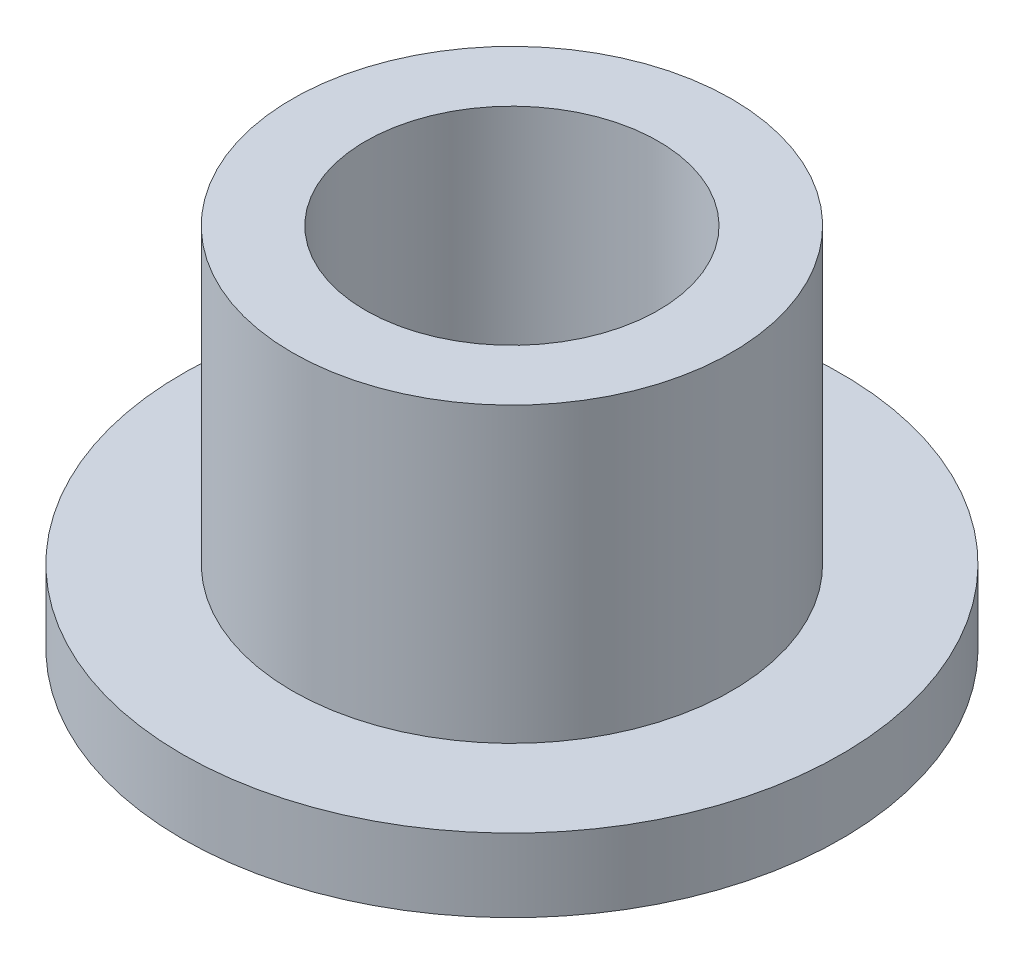
ISO-10303-21;
HEADER;
FILE_DESCRIPTION(('STEP AP214'),'2;1');
FILE_NAME('part.step','',(''),(''),'','','');
FILE_SCHEMA(('AUTOMOTIVE_DESIGN { 1 0 10303 214 1 1 1 1 }'));
ENDSEC;
DATA;
#1=APPLICATION_CONTEXT('core data for automotive mechanical design processes');
#2=APPLICATION_PROTOCOL_DEFINITION('international standard','automotive_design',2000,#1);
#3=PRODUCT_CONTEXT('',#1,'mechanical');
#4=PRODUCT('Part','Part','',(#3));
#5=PRODUCT_RELATED_PRODUCT_CATEGORY('part','',(#4));
#6=PRODUCT_DEFINITION_FORMATION('','',#4);
#7=PRODUCT_DEFINITION_CONTEXT('part definition',#1,'design');
#8=PRODUCT_DEFINITION('design','',#6,#7);
#9=PRODUCT_DEFINITION_SHAPE('','',#8);
#10=(LENGTH_UNIT() NAMED_UNIT(*) SI_UNIT(.MILLI.,.METRE.));
#11=(NAMED_UNIT(*) PLANE_ANGLE_UNIT() SI_UNIT($,.RADIAN.));
#12=(NAMED_UNIT(*) SI_UNIT($,.STERADIAN.) SOLID_ANGLE_UNIT());
#13=UNCERTAINTY_MEASURE_WITH_UNIT(LENGTH_MEASURE(1.E-05),#10,'distance_accuracy_value','');
#14=(GEOMETRIC_REPRESENTATION_CONTEXT(3) GLOBAL_UNCERTAINTY_ASSIGNED_CONTEXT((#13)) GLOBAL_UNIT_ASSIGNED_CONTEXT((#10,
#11,#12)) REPRESENTATION_CONTEXT('',''));
#15=CARTESIAN_POINT('',(0.,0.,0.));
#16=DIRECTION('',(0.,0.,1.));
#17=DIRECTION('',(1.,0.,0.));
#18=AXIS2_PLACEMENT_3D('',#15,#16,#17);
#19=CARTESIAN_POINT('',(0.,3.175,0.));
#20=DIRECTION('',(0.,1.,0.));
#21=DIRECTION('',(0.,0.,1.));
#22=AXIS2_PLACEMENT_3D('',#19,#20,#21);
#23=PLANE('',#22);
#24=CARTESIAN_POINT('',(0.,3.175,0.));
#25=DIRECTION('',(0.,1.,0.));
#26=DIRECTION('',(0.,0.,1.));
#27=AXIS2_PLACEMENT_3D('',#24,#25,#26);
#28=CIRCLE('',#27,14.2875);
#29=CARTESIAN_POINT('',(0.,3.175,14.2875));
#30=VERTEX_POINT('',#29);
#31=EDGE_CURVE('E38',#30,#30,#28,.T.);
#32=ORIENTED_EDGE('',*,*,#31,.T.);
#33=EDGE_LOOP('',(#32));
#34=FACE_BOUND('',#33,.T.);
#35=CARTESIAN_POINT('',(0.,3.175,0.));
#36=DIRECTION('',(0.,1.,0.));
#37=DIRECTION('',(0.,0.,1.));
#38=AXIS2_PLACEMENT_3D('',#35,#36,#37);
#39=CIRCLE('',#38,9.525);
#40=CARTESIAN_POINT('',(0.,3.175,9.525));
#41=VERTEX_POINT('',#40);
#42=EDGE_CURVE('E49',#41,#41,#39,.T.);
#43=ORIENTED_EDGE('',*,*,#42,.F.);
#44=EDGE_LOOP('',(#43));
#45=FACE_BOUND('',#44,.T.);
#46=ADVANCED_FACE('F31',(#34,#45),#23,.T.);
#47=CARTESIAN_POINT('',(0.,3.175,0.));
#48=DIRECTION('',(0.,-1.,0.));
#49=DIRECTION('',(0.,0.,-1.));
#50=AXIS2_PLACEMENT_3D('',#47,#48,#49);
#51=CYLINDRICAL_SURFACE('',#50,14.2875);
#52=ORIENTED_EDGE('',*,*,#31,.F.);
#53=EDGE_LOOP('',(#52));
#54=FACE_BOUND('',#53,.T.);
#55=CARTESIAN_POINT('',(0.,0.,0.));
#56=DIRECTION('',(0.,1.,0.));
#57=DIRECTION('',(0.,0.,1.));
#58=AXIS2_PLACEMENT_3D('',#55,#56,#57);
#59=CIRCLE('',#58,14.2875);
#60=CARTESIAN_POINT('',(0.,0.,14.2875));
#61=VERTEX_POINT('',#60);
#62=EDGE_CURVE('E42',#61,#61,#59,.T.);
#63=ORIENTED_EDGE('',*,*,#62,.T.);
#64=EDGE_LOOP('',(#63));
#65=FACE_BOUND('',#64,.T.);
#66=ADVANCED_FACE('F33',(#54,#65),#51,.T.);
#67=CARTESIAN_POINT('',(0.,0.,0.));
#68=DIRECTION('',(0.,1.,0.));
#69=DIRECTION('',(0.,0.,1.));
#70=AXIS2_PLACEMENT_3D('',#67,#68,#69);
#71=PLANE('',#70);
#72=ORIENTED_EDGE('',*,*,#62,.F.);
#73=EDGE_LOOP('',(#72));
#74=FACE_BOUND('',#73,.T.);
#75=ADVANCED_FACE('F63',(#74),#71,.F.);
#76=CARTESIAN_POINT('',(0.,15.875,0.));
#77=DIRECTION('',(0.,1.,0.));
#78=DIRECTION('',(0.,0.,1.));
#79=AXIS2_PLACEMENT_3D('',#76,#77,#78);
#80=PLANE('',#79);
#81=CARTESIAN_POINT('',(0.,15.875,0.));
#82=DIRECTION('',(0.,1.,0.));
#83=DIRECTION('',(0.,0.,1.));
#84=AXIS2_PLACEMENT_3D('',#81,#82,#83);
#85=CIRCLE('',#84,9.525);
#86=CARTESIAN_POINT('',(0.,15.875,9.525));
#87=VERTEX_POINT('',#86);
#88=EDGE_CURVE('E47',#87,#87,#85,.T.);
#89=ORIENTED_EDGE('',*,*,#88,.T.);
#90=EDGE_LOOP('',(#89));
#91=FACE_BOUND('',#90,.T.);
#92=CARTESIAN_POINT('',(0.,15.875,0.));
#93=DIRECTION('',(0.,1.,0.));
#94=DIRECTION('',(0.,0.,1.));
#95=AXIS2_PLACEMENT_3D('',#92,#93,#94);
#96=CIRCLE('',#95,6.35);
#97=CARTESIAN_POINT('',(0.,15.875,6.35));
#98=VERTEX_POINT('',#97);
#99=EDGE_CURVE('E52',#98,#98,#96,.T.);
#100=ORIENTED_EDGE('',*,*,#99,.F.);
#101=EDGE_LOOP('',(#100));
#102=FACE_BOUND('',#101,.T.);
#103=ADVANCED_FACE('F60',(#91,#102),#80,.T.);
#104=CARTESIAN_POINT('',(0.,15.875,0.));
#105=DIRECTION('',(0.,-1.,0.));
#106=DIRECTION('',(0.,0.,-1.));
#107=AXIS2_PLACEMENT_3D('',#104,#105,#106);
#108=CYLINDRICAL_SURFACE('',#107,9.525);
#109=ORIENTED_EDGE('',*,*,#88,.F.);
#110=EDGE_LOOP('',(#109));
#111=FACE_BOUND('',#110,.T.);
#112=ORIENTED_EDGE('',*,*,#42,.T.);
#113=EDGE_LOOP('',(#112));
#114=FACE_BOUND('',#113,.T.);
#115=ADVANCED_FACE('F62',(#111,#114),#108,.T.);
#116=CARTESIAN_POINT('',(0.,15.875,0.));
#117=DIRECTION('',(0.,-1.,0.));
#118=DIRECTION('',(0.,0.,-1.));
#119=AXIS2_PLACEMENT_3D('',#116,#117,#118);
#120=CYLINDRICAL_SURFACE('',#119,6.35);
#121=ORIENTED_EDGE('',*,*,#99,.T.);
#122=EDGE_LOOP('',(#121));
#123=FACE_BOUND('',#122,.T.);
#124=CARTESIAN_POINT('',(0.,3.175,0.));
#125=DIRECTION('',(0.,1.,0.));
#126=DIRECTION('',(0.,0.,1.));
#127=AXIS2_PLACEMENT_3D('',#124,#125,#126);
#128=CIRCLE('',#127,6.35);
#129=CARTESIAN_POINT('',(0.,3.175,6.35));
#130=VERTEX_POINT('',#129);
#131=EDGE_CURVE('E10',#130,#130,#128,.F.);
#132=ORIENTED_EDGE('',*,*,#131,.T.);
#133=EDGE_LOOP('',(#132));
#134=FACE_BOUND('',#133,.T.);
#135=ADVANCED_FACE('F58',(#123,#134),#120,.F.);
#136=ORIENTED_EDGE('',*,*,#131,.F.);
#137=EDGE_LOOP('',(#136));
#138=FACE_BOUND('',#137,.T.);
#139=ADVANCED_FACE('F76',(#138),#23,.T.);
#140=CLOSED_SHELL('',(#46,#66,#75,#103,#115,#135,#139));
#141=MANIFOLD_SOLID_BREP('B2',#140);
#142=ADVANCED_BREP_SHAPE_REPRESENTATION('',(#18,#141),#14);
#143=SHAPE_DEFINITION_REPRESENTATION(#9,#142);
ENDSEC;
END-ISO-10303-21;
